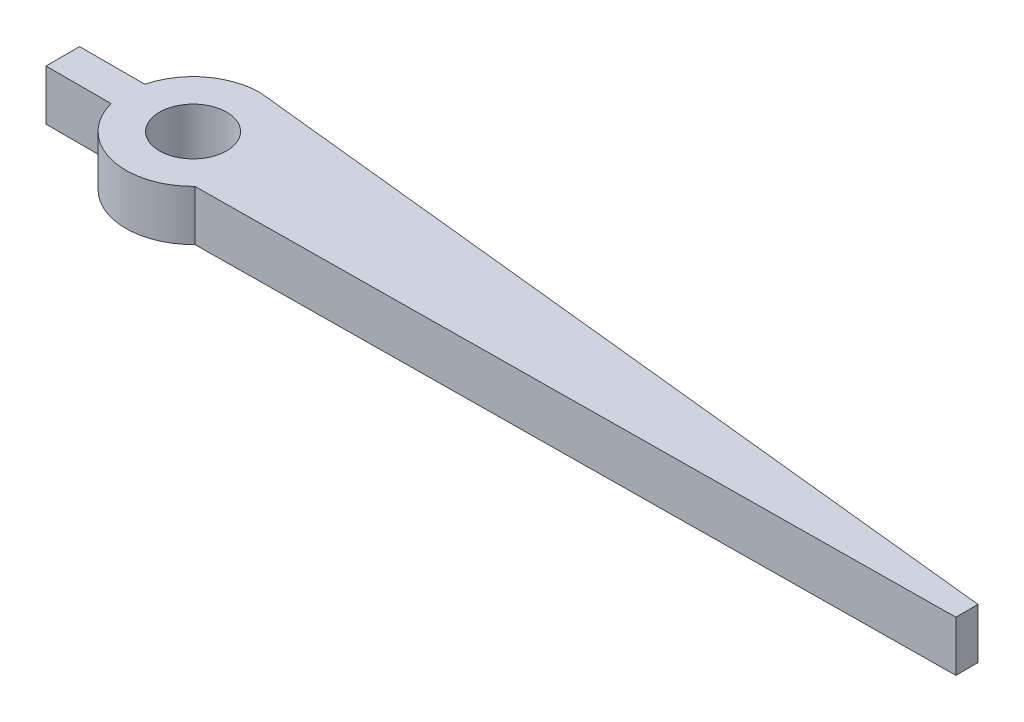
ISO-10303-21;
HEADER;
FILE_DESCRIPTION(('STEP AP214'),'2;1');
FILE_NAME('part.step','',(''),(''),'','','');
FILE_SCHEMA(('AUTOMOTIVE_DESIGN { 1 0 10303 214 1 1 1 1 }'));
ENDSEC;
DATA;
#1=APPLICATION_CONTEXT('core data for automotive mechanical design processes');
#2=APPLICATION_PROTOCOL_DEFINITION('international standard','automotive_design',2000,#1);
#3=PRODUCT_CONTEXT('',#1,'mechanical');
#4=PRODUCT('Part','Part','',(#3));
#5=PRODUCT_RELATED_PRODUCT_CATEGORY('part','',(#4));
#6=PRODUCT_DEFINITION_FORMATION('','',#4);
#7=PRODUCT_DEFINITION_CONTEXT('part definition',#1,'design');
#8=PRODUCT_DEFINITION('design','',#6,#7);
#9=PRODUCT_DEFINITION_SHAPE('','',#8);
#10=(LENGTH_UNIT() NAMED_UNIT(*) SI_UNIT(.MILLI.,.METRE.));
#11=(NAMED_UNIT(*) PLANE_ANGLE_UNIT() SI_UNIT($,.RADIAN.));
#12=(NAMED_UNIT(*) SI_UNIT($,.STERADIAN.) SOLID_ANGLE_UNIT());
#13=UNCERTAINTY_MEASURE_WITH_UNIT(LENGTH_MEASURE(1.E-05),#10,'distance_accuracy_value','');
#14=(GEOMETRIC_REPRESENTATION_CONTEXT(3) GLOBAL_UNCERTAINTY_ASSIGNED_CONTEXT((#13)) GLOBAL_UNIT_ASSIGNED_CONTEXT((#10,
#11,#12)) REPRESENTATION_CONTEXT('',''));
#15=CARTESIAN_POINT('',(0.,0.,0.));
#16=DIRECTION('',(0.,0.,1.));
#17=DIRECTION('',(1.,0.,0.));
#18=AXIS2_PLACEMENT_3D('',#15,#16,#17);
#19=CARTESIAN_POINT('',(1.39491392771798,1.5,-13.2717194905799));
#20=DIRECTION('',(0.104528463267654,0.,-0.994521895368273));
#21=DIRECTION('',(-0.994521895368273,0.,-0.104528463267654));
#22=AXIS2_PLACEMENT_3D('',#19,#20,#21);
#23=PLANE('',#22);
#24=DIRECTION('',(0.994521895368273,0.,0.104528463267654));
#25=VECTOR('',#24,1.);
#26=CARTESIAN_POINT('',(1.39491392771798,0.,-13.2717194905799));
#27=LINE('',#26,#25);
#28=CARTESIAN_POINT('',(-40.4795822764462,0.,-17.672906391254));
#29=VERTEX_POINT('',#28);
#30=CARTESIAN_POINT('',(-16.6110567876076,0.,-15.1642232728303));
#31=VERTEX_POINT('',#30);
#32=EDGE_CURVE('E146',#29,#31,#27,.T.);
#33=ORIENTED_EDGE('',*,*,#32,.F.);
#34=DIRECTION('',(0.,-1.,0.));
#35=VECTOR('',#34,1.);
#36=CARTESIAN_POINT('',(-40.4795822764462,1.5,-17.672906391254));
#37=LINE('',#36,#35);
#38=CARTESIAN_POINT('',(-40.4795822764462,1.5,-17.672906391254));
#39=VERTEX_POINT('',#38);
#40=EDGE_CURVE('E11',#39,#29,#37,.T.);
#41=ORIENTED_EDGE('',*,*,#40,.F.);
#42=DIRECTION('',(0.994521895368273,0.,0.104528463267654));
#43=VECTOR('',#42,1.);
#44=CARTESIAN_POINT('',(1.39491392771798,1.5,-13.2717194905799));
#45=LINE('',#44,#43);
#46=CARTESIAN_POINT('',(-16.6110567876076,1.5,-15.1642232728303));
#47=VERTEX_POINT('',#46);
#48=EDGE_CURVE('E174',#39,#47,#45,.T.);
#49=ORIENTED_EDGE('',*,*,#48,.T.);
#50=DIRECTION('',(0.,-1.,0.));
#51=VECTOR('',#50,1.);
#52=CARTESIAN_POINT('',(-16.6110567876076,1.5,-15.1642232728303));
#53=LINE('',#52,#51);
#54=EDGE_CURVE('E58',#47,#31,#53,.T.);
#55=ORIENTED_EDGE('',*,*,#54,.T.);
#56=EDGE_LOOP('',(#33,#41,#49,#55));
#57=FACE_BOUND('',#56,.T.);
#58=ADVANCED_FACE('F41',(#57),#23,.T.);
#59=CARTESIAN_POINT('',(-40.4795822764462,1.5,-15.672906391254));
#60=DIRECTION('',(0.,-1.,0.));
#61=DIRECTION('',(0.,0.,-1.));
#62=AXIS2_PLACEMENT_3D('',#59,#60,#61);
#63=CYLINDRICAL_SURFACE('',#62,2.);
#64=CARTESIAN_POINT('',(-40.4795822764462,0.,-15.672906391254));
#65=DIRECTION('',(0.,1.,0.));
#66=DIRECTION('',(0.,0.,1.));
#67=AXIS2_PLACEMENT_3D('',#64,#65,#66);
#68=CIRCLE('',#67,2.);
#69=CARTESIAN_POINT('',(-42.4160739495499,0.,-16.172906391254));
#70=VERTEX_POINT('',#69);
#71=EDGE_CURVE('E149',#29,#70,#68,.T.);
#72=ORIENTED_EDGE('',*,*,#71,.T.);
#73=DIRECTION('',(0.,-1.,0.));
#74=VECTOR('',#73,1.);
#75=CARTESIAN_POINT('',(-42.4160739495499,1.5,-16.172906391254));
#76=LINE('',#75,#74);
#77=CARTESIAN_POINT('',(-42.4160739495499,1.5,-16.172906391254));
#78=VERTEX_POINT('',#77);
#79=EDGE_CURVE('E50',#78,#70,#76,.T.);
#80=ORIENTED_EDGE('',*,*,#79,.F.);
#81=CARTESIAN_POINT('',(-40.4795822764462,1.5,-15.672906391254));
#82=DIRECTION('',(0.,1.,0.));
#83=DIRECTION('',(0.,0.,1.));
#84=AXIS2_PLACEMENT_3D('',#81,#82,#83);
#85=CIRCLE('',#84,2.);
#86=EDGE_CURVE('E122',#39,#78,#85,.T.);
#87=ORIENTED_EDGE('',*,*,#86,.F.);
#88=ORIENTED_EDGE('',*,*,#40,.T.);
#89=EDGE_LOOP('',(#72,#80,#87,#88));
#90=FACE_BOUND('',#89,.T.);
#91=ADVANCED_FACE('F227',(#90),#63,.T.);
#92=CARTESIAN_POINT('',(0.,1.5,-16.172906391254));
#93=DIRECTION('',(0.,0.,1.));
#94=DIRECTION('',(1.,0.,0.));
#95=AXIS2_PLACEMENT_3D('',#92,#93,#94);
#96=PLANE('',#95);
#97=DIRECTION('',(-1.,0.,0.));
#98=VECTOR('',#97,1.);
#99=CARTESIAN_POINT('',(0.,0.,-16.172906391254));
#100=LINE('',#99,#98);
#101=CARTESIAN_POINT('',(-44.3560739495499,0.,-16.172906391254));
#102=VERTEX_POINT('',#101);
#103=EDGE_CURVE('E152',#70,#102,#100,.T.);
#104=ORIENTED_EDGE('',*,*,#103,.T.);
#105=DIRECTION('',(0.,-1.,0.));
#106=VECTOR('',#105,1.);
#107=CARTESIAN_POINT('',(-44.3560739495499,1.5,-16.172906391254));
#108=LINE('',#107,#106);
#109=CARTESIAN_POINT('',(-44.3560739495499,1.5,-16.172906391254));
#110=VERTEX_POINT('',#109);
#111=EDGE_CURVE('E184',#110,#102,#108,.T.);
#112=ORIENTED_EDGE('',*,*,#111,.F.);
#113=DIRECTION('',(-1.,0.,0.));
#114=VECTOR('',#113,1.);
#115=CARTESIAN_POINT('',(0.,1.5,-16.172906391254));
#116=LINE('',#115,#114);
#117=EDGE_CURVE('E195',#78,#110,#116,.T.);
#118=ORIENTED_EDGE('',*,*,#117,.F.);
#119=ORIENTED_EDGE('',*,*,#79,.T.);
#120=EDGE_LOOP('',(#104,#112,#118,#119));
#121=FACE_BOUND('',#120,.T.);
#122=ADVANCED_FACE('F193',(#121),#96,.F.);
#123=CARTESIAN_POINT('',(-44.3560739495499,1.5,0.));
#124=DIRECTION('',(1.,0.,0.));
#125=DIRECTION('',(0.,0.,-1.));
#126=AXIS2_PLACEMENT_3D('',#123,#124,#125);
#127=PLANE('',#126);
#128=DIRECTION('',(0.,0.,1.));
#129=VECTOR('',#128,1.);
#130=CARTESIAN_POINT('',(-44.3560739495499,0.,0.));
#131=LINE('',#130,#129);
#132=CARTESIAN_POINT('',(-44.3560739495499,0.,-15.172906391254));
#133=VERTEX_POINT('',#132);
#134=EDGE_CURVE('E155',#102,#133,#131,.T.);
#135=ORIENTED_EDGE('',*,*,#134,.T.);
#136=DIRECTION('',(0.,-1.,0.));
#137=VECTOR('',#136,1.);
#138=CARTESIAN_POINT('',(-44.3560739495499,1.5,-15.172906391254));
#139=LINE('',#138,#137);
#140=CARTESIAN_POINT('',(-44.3560739495499,1.5,-15.172906391254));
#141=VERTEX_POINT('',#140);
#142=EDGE_CURVE('E181',#141,#133,#139,.T.);
#143=ORIENTED_EDGE('',*,*,#142,.F.);
#144=DIRECTION('',(0.,0.,1.));
#145=VECTOR('',#144,1.);
#146=CARTESIAN_POINT('',(-44.3560739495499,1.5,0.));
#147=LINE('',#146,#145);
#148=EDGE_CURVE('E207',#110,#141,#147,.T.);
#149=ORIENTED_EDGE('',*,*,#148,.F.);
#150=ORIENTED_EDGE('',*,*,#111,.T.);
#151=EDGE_LOOP('',(#135,#143,#149,#150));
#152=FACE_BOUND('',#151,.T.);
#153=ADVANCED_FACE('F205',(#152),#127,.F.);
#154=CARTESIAN_POINT('',(0.,1.5,-15.172906391254));
#155=DIRECTION('',(0.,0.,1.));
#156=DIRECTION('',(1.,0.,0.));
#157=AXIS2_PLACEMENT_3D('',#154,#155,#156);
#158=PLANE('',#157);
#159=DIRECTION('',(-1.,0.,0.));
#160=VECTOR('',#159,1.);
#161=CARTESIAN_POINT('',(0.,0.,-15.172906391254));
#162=LINE('',#161,#160);
#163=CARTESIAN_POINT('',(-42.4160739495499,0.,-15.172906391254));
#164=VERTEX_POINT('',#163);
#165=EDGE_CURVE('E159',#164,#133,#162,.T.);
#166=ORIENTED_EDGE('',*,*,#165,.F.);
#167=DIRECTION('',(0.,-1.,0.));
#168=VECTOR('',#167,1.);
#169=CARTESIAN_POINT('',(-42.4160739495499,1.5,-15.172906391254));
#170=LINE('',#169,#168);
#171=CARTESIAN_POINT('',(-42.4160739495499,1.5,-15.172906391254));
#172=VERTEX_POINT('',#171);
#173=EDGE_CURVE('E131',#172,#164,#170,.T.);
#174=ORIENTED_EDGE('',*,*,#173,.F.);
#175=DIRECTION('',(-1.,0.,0.));
#176=VECTOR('',#175,1.);
#177=CARTESIAN_POINT('',(0.,1.5,-15.172906391254));
#178=LINE('',#177,#176);
#179=EDGE_CURVE('E118',#172,#141,#178,.T.);
#180=ORIENTED_EDGE('',*,*,#179,.T.);
#181=ORIENTED_EDGE('',*,*,#142,.T.);
#182=EDGE_LOOP('',(#166,#174,#180,#181));
#183=FACE_BOUND('',#182,.T.);
#184=ADVANCED_FACE('F237',(#183),#158,.T.);
#185=CARTESIAN_POINT('',(-39.0384701068818,0.,-14.2861130704115));
#186=VERTEX_POINT('',#185);
#187=EDGE_CURVE('E127',#164,#186,#68,.T.);
#188=ORIENTED_EDGE('',*,*,#187,.T.);
#189=DIRECTION('',(0.,-1.,0.));
#190=VECTOR('',#189,1.);
#191=CARTESIAN_POINT('',(-39.0384701068818,1.5,-14.2861130704115));
#192=LINE('',#191,#190);
#193=CARTESIAN_POINT('',(-39.0384701068818,1.5,-14.2861130704115));
#194=VERTEX_POINT('',#193);
#195=EDGE_CURVE('E124',#194,#186,#192,.T.);
#196=ORIENTED_EDGE('',*,*,#195,.F.);
#197=EDGE_CURVE('E109',#172,#194,#85,.T.);
#198=ORIENTED_EDGE('',*,*,#197,.F.);
#199=ORIENTED_EDGE('',*,*,#173,.T.);
#200=EDGE_LOOP('',(#188,#196,#198,#199));
#201=FACE_BOUND('',#200,.T.);
#202=ADVANCED_FACE('F125',(#201),#63,.T.);
#203=CARTESIAN_POINT('',(-0.143277801591824,1.5,-14.6660927780494));
#204=DIRECTION('',(-0.00976885712205816,0.,-0.999952283576836));
#205=DIRECTION('',(-0.999952283576836,0.,0.00976885712205816));
#206=AXIS2_PLACEMENT_3D('',#203,#204,#205);
#207=PLANE('',#206);
#208=DIRECTION('',(0.999952283576836,0.,-0.00976885712205816));
#209=VECTOR('',#208,1.);
#210=CARTESIAN_POINT('',(-0.143277801591824,0.,-14.6660927780494));
#211=LINE('',#210,#209);
#212=CARTESIAN_POINT('',(-16.6110567876076,0.,-14.5052137214442));
#213=VERTEX_POINT('',#212);
#214=EDGE_CURVE('E163',#186,#213,#211,.T.);
#215=ORIENTED_EDGE('',*,*,#214,.T.);
#216=DIRECTION('',(0.,-1.,0.));
#217=VECTOR('',#216,1.);
#218=CARTESIAN_POINT('',(-16.6110567876076,1.5,-14.5052137214442));
#219=LINE('',#218,#217);
#220=CARTESIAN_POINT('',(-16.6110567876076,1.5,-14.5052137214442));
#221=VERTEX_POINT('',#220);
#222=EDGE_CURVE('E84',#221,#213,#219,.T.);
#223=ORIENTED_EDGE('',*,*,#222,.F.);
#224=DIRECTION('',(0.999952283576836,0.,-0.00976885712205816));
#225=VECTOR('',#224,1.);
#226=CARTESIAN_POINT('',(-0.143277801591824,1.5,-14.6660927780494));
#227=LINE('',#226,#225);
#228=EDGE_CURVE('E116',#194,#221,#227,.T.);
#229=ORIENTED_EDGE('',*,*,#228,.F.);
#230=ORIENTED_EDGE('',*,*,#195,.T.);
#231=EDGE_LOOP('',(#215,#223,#229,#230));
#232=FACE_BOUND('',#231,.T.);
#233=ADVANCED_FACE('F133',(#232),#207,.F.);
#234=CARTESIAN_POINT('',(-16.6110567876077,1.5,0.));
#235=DIRECTION('',(1.,0.,0.));
#236=DIRECTION('',(0.,0.,-1.));
#237=AXIS2_PLACEMENT_3D('',#234,#235,#236);
#238=PLANE('',#237);
#239=DIRECTION('',(0.,0.,1.));
#240=VECTOR('',#239,1.);
#241=CARTESIAN_POINT('',(-16.6110567876077,0.,0.));
#242=LINE('',#241,#240);
#243=EDGE_CURVE('E166',#31,#213,#242,.T.);
#244=ORIENTED_EDGE('',*,*,#243,.F.);
#245=ORIENTED_EDGE('',*,*,#54,.F.);
#246=DIRECTION('',(0.,0.,1.));
#247=VECTOR('',#246,1.);
#248=CARTESIAN_POINT('',(-16.6110567876077,1.5,0.));
#249=LINE('',#248,#247);
#250=EDGE_CURVE('E135',#47,#221,#249,.T.);
#251=ORIENTED_EDGE('',*,*,#250,.T.);
#252=ORIENTED_EDGE('',*,*,#222,.T.);
#253=EDGE_LOOP('',(#244,#245,#251,#252));
#254=FACE_BOUND('',#253,.T.);
#255=ADVANCED_FACE('F215',(#254),#238,.T.);
#256=CARTESIAN_POINT('',(-40.4795822764462,1.5,-15.672906391254));
#257=DIRECTION('',(0.,-1.,0.));
#258=DIRECTION('',(0.,0.,-1.));
#259=AXIS2_PLACEMENT_3D('',#256,#257,#258);
#260=CYLINDRICAL_SURFACE('',#259,0.999999999999998);
#261=CARTESIAN_POINT('',(-40.4795822764462,1.5,-15.672906391254));
#262=DIRECTION('',(0.,1.,0.));
#263=DIRECTION('',(0.,0.,1.));
#264=AXIS2_PLACEMENT_3D('',#261,#262,#263);
#265=CIRCLE('',#264,0.999999999999998);
#266=CARTESIAN_POINT('',(-40.4795822764462,1.5,-14.672906391254));
#267=VERTEX_POINT('',#266);
#268=EDGE_CURVE('E138',#267,#267,#265,.T.);
#269=ORIENTED_EDGE('',*,*,#268,.T.);
#270=EDGE_LOOP('',(#269));
#271=FACE_BOUND('',#270,.T.);
#272=CARTESIAN_POINT('',(-40.4795822764462,0.,-15.672906391254));
#273=DIRECTION('',(0.,1.,0.));
#274=DIRECTION('',(0.,0.,1.));
#275=AXIS2_PLACEMENT_3D('',#272,#273,#274);
#276=CIRCLE('',#275,0.999999999999998);
#277=CARTESIAN_POINT('',(-40.4795822764462,0.,-14.672906391254));
#278=VERTEX_POINT('',#277);
#279=EDGE_CURVE('E170',#278,#278,#276,.T.);
#280=ORIENTED_EDGE('',*,*,#279,.F.);
#281=EDGE_LOOP('',(#280));
#282=FACE_BOUND('',#281,.T.);
#283=ADVANCED_FACE('F217',(#271,#282),#260,.F.);
#284=CARTESIAN_POINT('',(0.,1.5,0.));
#285=DIRECTION('',(0.,1.,0.));
#286=DIRECTION('',(0.,0.,1.));
#287=AXIS2_PLACEMENT_3D('',#284,#285,#286);
#288=PLANE('',#287);
#289=ORIENTED_EDGE('',*,*,#48,.F.);
#290=ORIENTED_EDGE('',*,*,#86,.T.);
#291=ORIENTED_EDGE('',*,*,#117,.T.);
#292=ORIENTED_EDGE('',*,*,#148,.T.);
#293=ORIENTED_EDGE('',*,*,#179,.F.);
#294=ORIENTED_EDGE('',*,*,#197,.T.);
#295=ORIENTED_EDGE('',*,*,#228,.T.);
#296=ORIENTED_EDGE('',*,*,#250,.F.);
#297=EDGE_LOOP('',(#289,#290,#291,#292,#293,#294,#295,#296));
#298=FACE_BOUND('',#297,.T.);
#299=ORIENTED_EDGE('',*,*,#268,.F.);
#300=EDGE_LOOP('',(#299));
#301=FACE_BOUND('',#300,.T.);
#302=ADVANCED_FACE('F112',(#298,#301),#288,.T.);
#303=CARTESIAN_POINT('',(0.,0.,0.));
#304=DIRECTION('',(0.,1.,0.));
#305=DIRECTION('',(0.,0.,1.));
#306=AXIS2_PLACEMENT_3D('',#303,#304,#305);
#307=PLANE('',#306);
#308=ORIENTED_EDGE('',*,*,#32,.T.);
#309=ORIENTED_EDGE('',*,*,#243,.T.);
#310=ORIENTED_EDGE('',*,*,#214,.F.);
#311=ORIENTED_EDGE('',*,*,#187,.F.);
#312=ORIENTED_EDGE('',*,*,#165,.T.);
#313=ORIENTED_EDGE('',*,*,#134,.F.);
#314=ORIENTED_EDGE('',*,*,#103,.F.);
#315=ORIENTED_EDGE('',*,*,#71,.F.);
#316=EDGE_LOOP('',(#308,#309,#310,#311,#312,#313,#314,#315));
#317=FACE_BOUND('',#316,.T.);
#318=ORIENTED_EDGE('',*,*,#279,.T.);
#319=EDGE_LOOP('',(#318));
#320=FACE_BOUND('',#319,.T.);
#321=ADVANCED_FACE('F200',(#317,#320),#307,.F.);
#322=CLOSED_SHELL('',(#58,#91,#122,#153,#184,#202,#233,#255,#283,#302,#321));
#323=MANIFOLD_SOLID_BREP('B2',#322);
#324=ADVANCED_BREP_SHAPE_REPRESENTATION('',(#18,#323),#14);
#325=SHAPE_DEFINITION_REPRESENTATION(#9,#324);
ENDSEC;
END-ISO-10303-21;
